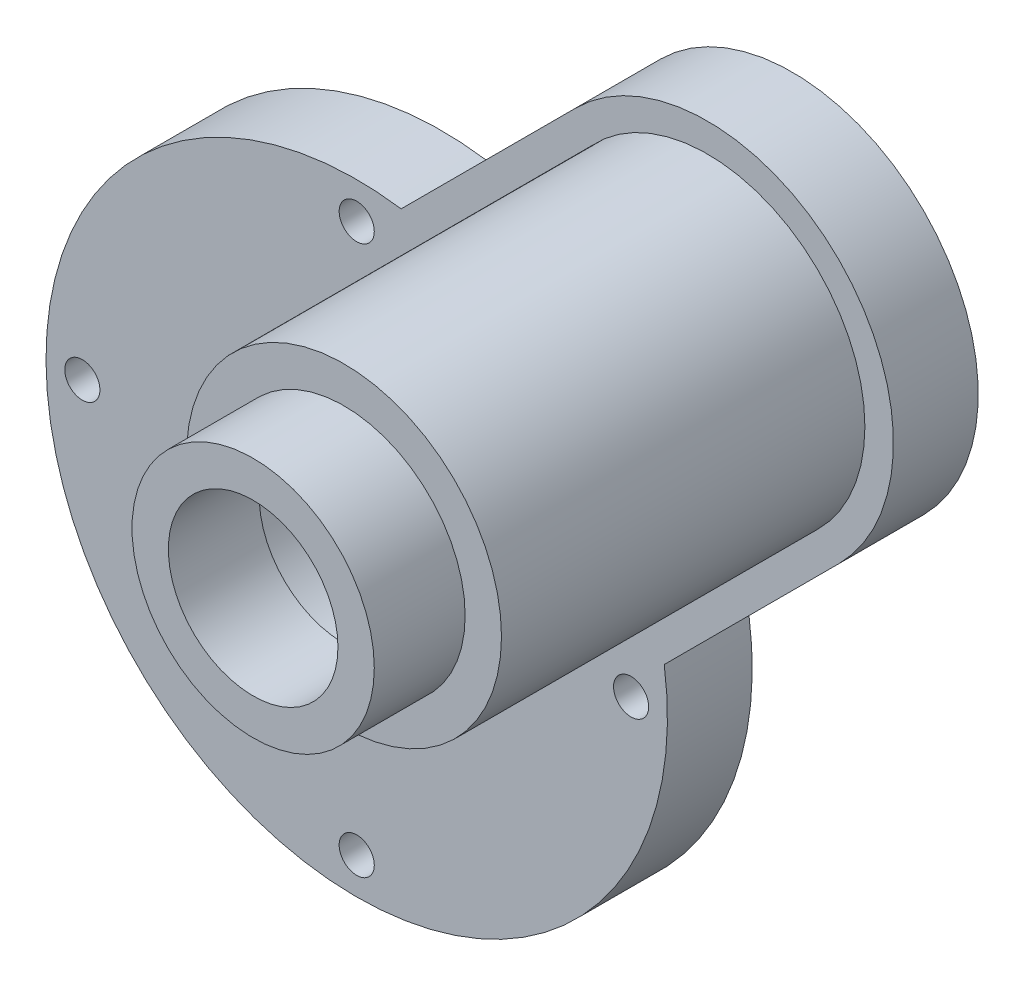
ISO-10303-21;
HEADER;
FILE_DESCRIPTION(('STEP AP214'),'2;1');
FILE_NAME('part.step','',(''),(''),'','','');
FILE_SCHEMA(('AUTOMOTIVE_DESIGN { 1 0 10303 214 1 1 1 1 }'));
ENDSEC;
DATA;
#1=APPLICATION_CONTEXT('core data for automotive mechanical design processes');
#2=APPLICATION_PROTOCOL_DEFINITION('international standard','automotive_design',2000,#1);
#3=PRODUCT_CONTEXT('',#1,'mechanical');
#4=PRODUCT('Part','Part','',(#3));
#5=PRODUCT_RELATED_PRODUCT_CATEGORY('part','',(#4));
#6=PRODUCT_DEFINITION_FORMATION('','',#4);
#7=PRODUCT_DEFINITION_CONTEXT('part definition',#1,'design');
#8=PRODUCT_DEFINITION('design','',#6,#7);
#9=PRODUCT_DEFINITION_SHAPE('','',#8);
#10=(LENGTH_UNIT() NAMED_UNIT(*) SI_UNIT(.MILLI.,.METRE.));
#11=(NAMED_UNIT(*) PLANE_ANGLE_UNIT() SI_UNIT($,.RADIAN.));
#12=(NAMED_UNIT(*) SI_UNIT($,.STERADIAN.) SOLID_ANGLE_UNIT());
#13=UNCERTAINTY_MEASURE_WITH_UNIT(LENGTH_MEASURE(1.E-05),#10,'distance_accuracy_value','');
#14=(GEOMETRIC_REPRESENTATION_CONTEXT(3) GLOBAL_UNCERTAINTY_ASSIGNED_CONTEXT((#13)) GLOBAL_UNIT_ASSIGNED_CONTEXT((#10,
#11,#12)) REPRESENTATION_CONTEXT('',''));
#15=CARTESIAN_POINT('',(0.,0.,0.));
#16=DIRECTION('',(0.,0.,1.));
#17=DIRECTION('',(1.,0.,0.));
#18=AXIS2_PLACEMENT_3D('',#15,#16,#17);
#19=CARTESIAN_POINT('',(0.,0.,7.));
#20=DIRECTION('',(0.,0.,1.));
#21=DIRECTION('',(1.,0.,0.));
#22=AXIS2_PLACEMENT_3D('',#19,#20,#21);
#23=PLANE('',#22);
#24=CARTESIAN_POINT('',(0.,0.,7.));
#25=DIRECTION('',(0.,0.,1.));
#26=DIRECTION('',(1.,0.,0.));
#27=AXIS2_PLACEMENT_3D('',#24,#25,#26);
#28=CIRCLE('',#27,25.65);
#29=CARTESIAN_POINT('',(3.66864014307868,25.3862872334769,7.));
#30=VERTEX_POINT('',#29);
#31=CARTESIAN_POINT('',(25.3862872334769,3.66864014307877,7.));
#32=VERTEX_POINT('',#31);
#33=EDGE_CURVE('E88',#30,#32,#28,.T.);
#34=ORIENTED_EDGE('',*,*,#33,.T.);
#35=DIRECTION('',(-0.707106781186545,-0.70710678118655,0.));
#36=VECTOR('',#35,1.);
#37=CARTESIAN_POINT('',(10.8588235451991,-10.8588235451991,7.));
#38=LINE('',#37,#36);
#39=CARTESIAN_POINT('',(39.8101117808026,18.0924646904046,7.));
#40=VERTEX_POINT('',#39);
#41=EDGE_CURVE('E95',#40,#32,#38,.T.);
#42=ORIENTED_EDGE('',*,*,#41,.F.);
#43=CARTESIAN_POINT('',(28.9512882356036,28.9512882356036,7.));
#44=DIRECTION('',(0.,0.,1.));
#45=DIRECTION('',(1.,0.,0.));
#46=AXIS2_PLACEMENT_3D('',#43,#44,#45);
#47=CIRCLE('',#46,15.3566955290368);
#48=CARTESIAN_POINT('',(18.0924646904044,39.8101117808027,7.));
#49=VERTEX_POINT('',#48);
#50=EDGE_CURVE('E104',#49,#40,#47,.F.);
#51=ORIENTED_EDGE('',*,*,#50,.F.);
#52=DIRECTION('',(-0.707106781186547,-0.707106781186548,0.));
#53=VECTOR('',#52,1.);
#54=CARTESIAN_POINT('',(-10.8588235451991,10.8588235451991,7.));
#55=LINE('',#54,#53);
#56=EDGE_CURVE('E65',#49,#30,#55,.T.);
#57=ORIENTED_EDGE('',*,*,#56,.T.);
#58=EDGE_LOOP('',(#34,#42,#51,#57));
#59=FACE_BOUND('',#58,.T.);
#60=CARTESIAN_POINT('',(22.65,0.,7.));
#61=DIRECTION('',(0.,0.,1.));
#62=DIRECTION('',(1.,0.,0.));
#63=AXIS2_PLACEMENT_3D('',#60,#61,#62);
#64=CIRCLE('',#63,1.45);
#65=CARTESIAN_POINT('',(24.1,0.,7.));
#66=VERTEX_POINT('',#65);
#67=EDGE_CURVE('E206',#66,#66,#64,.T.);
#68=ORIENTED_EDGE('',*,*,#67,.F.);
#69=EDGE_LOOP('',(#68));
#70=FACE_BOUND('',#69,.T.);
#71=CARTESIAN_POINT('',(0.,0.,7.));
#72=DIRECTION('',(0.,0.,1.));
#73=DIRECTION('',(1.,0.,0.));
#74=AXIS2_PLACEMENT_3D('',#71,#72,#73);
#75=CIRCLE('',#74,4.);
#76=CARTESIAN_POINT('',(4.,0.,7.));
#77=VERTEX_POINT('',#76);
#78=EDGE_CURVE('E202',#77,#77,#75,.T.);
#79=ORIENTED_EDGE('',*,*,#78,.F.);
#80=EDGE_LOOP('',(#79));
#81=FACE_BOUND('',#80,.T.);
#82=CARTESIAN_POINT('',(0.,-22.65,7.));
#83=DIRECTION('',(0.,0.,1.));
#84=DIRECTION('',(1.,0.,0.));
#85=AXIS2_PLACEMENT_3D('',#82,#83,#84);
#86=CIRCLE('',#85,1.45);
#87=CARTESIAN_POINT('',(1.44999999999992,-22.65,7.));
#88=VERTEX_POINT('',#87);
#89=EDGE_CURVE('E198',#88,#88,#86,.T.);
#90=ORIENTED_EDGE('',*,*,#89,.F.);
#91=EDGE_LOOP('',(#90));
#92=FACE_BOUND('',#91,.T.);
#93=CARTESIAN_POINT('',(-22.65,1.58164104649594E-13,7.));
#94=DIRECTION('',(0.,0.,1.));
#95=DIRECTION('',(1.,0.,0.));
#96=AXIS2_PLACEMENT_3D('',#93,#94,#95);
#97=CIRCLE('',#96,1.45);
#98=CARTESIAN_POINT('',(-21.2,1.58164104649594E-13,7.));
#99=VERTEX_POINT('',#98);
#100=EDGE_CURVE('E194',#99,#99,#97,.T.);
#101=ORIENTED_EDGE('',*,*,#100,.F.);
#102=EDGE_LOOP('',(#101));
#103=FACE_BOUND('',#102,.T.);
#104=CARTESIAN_POINT('',(2.37246156974391E-13,22.65,7.));
#105=DIRECTION('',(0.,0.,1.));
#106=DIRECTION('',(1.,0.,0.));
#107=AXIS2_PLACEMENT_3D('',#104,#105,#106);
#108=CIRCLE('',#107,1.45);
#109=CARTESIAN_POINT('',(1.45000000000024,22.65,7.));
#110=VERTEX_POINT('',#109);
#111=EDGE_CURVE('E151',#110,#110,#108,.T.);
#112=ORIENTED_EDGE('',*,*,#111,.F.);
#113=EDGE_LOOP('',(#112));
#114=FACE_BOUND('',#113,.T.);
#115=CARTESIAN_POINT('',(28.9512882356036,28.9512882356036,7.));
#116=DIRECTION('',(0.,0.,1.));
#117=DIRECTION('',(1.,0.,0.));
#118=AXIS2_PLACEMENT_3D('',#115,#116,#117);
#119=CIRCLE('',#118,13.);
#120=CARTESIAN_POINT('',(41.9512882356036,28.9512882356036,7.));
#121=VERTEX_POINT('',#120);
#122=EDGE_CURVE('E176',#121,#121,#119,.T.);
#123=ORIENTED_EDGE('',*,*,#122,.F.);
#124=EDGE_LOOP('',(#123));
#125=FACE_BOUND('',#124,.T.);
#126=ADVANCED_FACE('F47',(#59,#70,#81,#92,#103,#114,#125),#23,.T.);
#127=CARTESIAN_POINT('',(0.,0.,7.));
#128=DIRECTION('',(0.,0.,-1.));
#129=DIRECTION('',(-1.,0.,0.));
#130=AXIS2_PLACEMENT_3D('',#127,#128,#129);
#131=CYLINDRICAL_SURFACE('',#130,25.65);
#132=CARTESIAN_POINT('',(0.,0.,0.));
#133=DIRECTION('',(0.,0.,1.));
#134=DIRECTION('',(1.,0.,0.));
#135=AXIS2_PLACEMENT_3D('',#132,#133,#134);
#136=CIRCLE('',#135,25.65);
#137=CARTESIAN_POINT('',(3.66864014307868,25.3862872334769,0.));
#138=VERTEX_POINT('',#137);
#139=CARTESIAN_POINT('',(25.3862872334769,3.66864014307877,0.));
#140=VERTEX_POINT('',#139);
#141=EDGE_CURVE('E136',#138,#140,#136,.T.);
#142=ORIENTED_EDGE('',*,*,#141,.T.);
#143=DIRECTION('',(0.,0.,-1.));
#144=VECTOR('',#143,1.);
#145=CARTESIAN_POINT('',(25.3862872334769,3.66864014307877,7.));
#146=LINE('',#145,#144);
#147=EDGE_CURVE('E11',#32,#140,#146,.T.);
#148=ORIENTED_EDGE('',*,*,#147,.F.);
#149=ORIENTED_EDGE('',*,*,#33,.F.);
#150=DIRECTION('',(0.,0.,-1.));
#151=VECTOR('',#150,1.);
#152=CARTESIAN_POINT('',(3.66864014307868,25.3862872334769,7.));
#153=LINE('',#152,#151);
#154=EDGE_CURVE('E111',#30,#138,#153,.T.);
#155=ORIENTED_EDGE('',*,*,#154,.T.);
#156=EDGE_LOOP('',(#142,#148,#149,#155));
#157=FACE_BOUND('',#156,.T.);
#158=ADVANCED_FACE('F157',(#157),#131,.T.);
#159=CARTESIAN_POINT('',(10.8588235451991,-10.8588235451991,7.));
#160=DIRECTION('',(0.70710678118655,-0.707106781186545,0.));
#161=DIRECTION('',(0.707106781186545,0.70710678118655,0.));
#162=AXIS2_PLACEMENT_3D('',#159,#160,#161);
#163=PLANE('',#162);
#164=DIRECTION('',(-0.707106781186545,-0.70710678118655,0.));
#165=VECTOR('',#164,1.);
#166=CARTESIAN_POINT('',(10.8588235451991,-10.8588235451991,0.));
#167=LINE('',#166,#165);
#168=CARTESIAN_POINT('',(39.8101117808026,18.0924646904046,0.));
#169=VERTEX_POINT('',#168);
#170=EDGE_CURVE('E97',#169,#140,#167,.T.);
#171=ORIENTED_EDGE('',*,*,#170,.F.);
#172=DIRECTION('',(0.,0.,-1.));
#173=VECTOR('',#172,1.);
#174=CARTESIAN_POINT('',(39.8101117808026,18.0924646904046,7.));
#175=LINE('',#174,#173);
#176=EDGE_CURVE('E57',#40,#169,#175,.T.);
#177=ORIENTED_EDGE('',*,*,#176,.F.);
#178=ORIENTED_EDGE('',*,*,#41,.T.);
#179=ORIENTED_EDGE('',*,*,#147,.T.);
#180=EDGE_LOOP('',(#171,#177,#178,#179));
#181=FACE_BOUND('',#180,.T.);
#182=ADVANCED_FACE('F94',(#181),#163,.T.);
#183=CARTESIAN_POINT('',(28.9512882356036,28.9512882356036,7.));
#184=DIRECTION('',(0.,0.,-1.));
#185=DIRECTION('',(-1.,0.,0.));
#186=AXIS2_PLACEMENT_3D('',#183,#184,#185);
#187=CYLINDRICAL_SURFACE('',#186,15.3566955290368);
#188=CARTESIAN_POINT('',(28.9512882356036,28.9512882356036,0.));
#189=DIRECTION('',(0.,0.,1.));
#190=DIRECTION('',(1.,0.,0.));
#191=AXIS2_PLACEMENT_3D('',#188,#189,#190);
#192=CIRCLE('',#191,15.3566955290368);
#193=CARTESIAN_POINT('',(18.0924646904044,39.8101117808027,0.));
#194=VERTEX_POINT('',#193);
#195=EDGE_CURVE('E142',#194,#169,#192,.F.);
#196=ORIENTED_EDGE('',*,*,#195,.F.);
#197=DIRECTION('',(0.,0.,-1.));
#198=VECTOR('',#197,1.);
#199=CARTESIAN_POINT('',(18.0924646904044,39.8101117808027,7.));
#200=LINE('',#199,#198);
#201=EDGE_CURVE('E80',#49,#194,#200,.T.);
#202=ORIENTED_EDGE('',*,*,#201,.F.);
#203=ORIENTED_EDGE('',*,*,#50,.T.);
#204=ORIENTED_EDGE('',*,*,#176,.T.);
#205=EDGE_LOOP('',(#196,#202,#203,#204));
#206=FACE_BOUND('',#205,.T.);
#207=ADVANCED_FACE('F107',(#206),#187,.T.);
#208=CARTESIAN_POINT('',(-10.8588235451991,10.8588235451991,7.));
#209=DIRECTION('',(0.707106781186548,-0.707106781186547,0.));
#210=DIRECTION('',(0.707106781186547,0.707106781186548,0.));
#211=AXIS2_PLACEMENT_3D('',#208,#209,#210);
#212=PLANE('',#211);
#213=DIRECTION('',(-0.707106781186547,-0.707106781186548,0.));
#214=VECTOR('',#213,1.);
#215=CARTESIAN_POINT('',(-10.8588235451991,10.8588235451991,0.));
#216=LINE('',#215,#214);
#217=EDGE_CURVE('E83',#194,#138,#216,.T.);
#218=ORIENTED_EDGE('',*,*,#217,.T.);
#219=ORIENTED_EDGE('',*,*,#154,.F.);
#220=ORIENTED_EDGE('',*,*,#56,.F.);
#221=ORIENTED_EDGE('',*,*,#201,.T.);
#222=EDGE_LOOP('',(#218,#219,#220,#221));
#223=FACE_BOUND('',#222,.T.);
#224=ADVANCED_FACE('F244',(#223),#212,.F.);
#225=CARTESIAN_POINT('',(22.65,0.,7.));
#226=DIRECTION('',(0.,0.,-1.));
#227=DIRECTION('',(-1.,0.,0.));
#228=AXIS2_PLACEMENT_3D('',#225,#226,#227);
#229=CYLINDRICAL_SURFACE('',#228,1.45);
#230=ORIENTED_EDGE('',*,*,#67,.T.);
#231=EDGE_LOOP('',(#230));
#232=FACE_BOUND('',#231,.T.);
#233=CARTESIAN_POINT('',(22.65,0.,0.));
#234=DIRECTION('',(0.,0.,1.));
#235=DIRECTION('',(1.,0.,0.));
#236=AXIS2_PLACEMENT_3D('',#233,#234,#235);
#237=CIRCLE('',#236,1.45);
#238=CARTESIAN_POINT('',(24.1,0.,0.));
#239=VERTEX_POINT('',#238);
#240=EDGE_CURVE('E132',#239,#239,#237,.T.);
#241=ORIENTED_EDGE('',*,*,#240,.F.);
#242=EDGE_LOOP('',(#241));
#243=FACE_BOUND('',#242,.T.);
#244=ADVANCED_FACE('F212',(#232,#243),#229,.F.);
#245=CARTESIAN_POINT('',(0.,0.,7.));
#246=DIRECTION('',(0.,0.,-1.));
#247=DIRECTION('',(-1.,0.,0.));
#248=AXIS2_PLACEMENT_3D('',#245,#246,#247);
#249=CYLINDRICAL_SURFACE('',#248,4.);
#250=ORIENTED_EDGE('',*,*,#78,.T.);
#251=EDGE_LOOP('',(#250));
#252=FACE_BOUND('',#251,.T.);
#253=CARTESIAN_POINT('',(0.,0.,0.));
#254=DIRECTION('',(0.,0.,1.));
#255=DIRECTION('',(1.,0.,0.));
#256=AXIS2_PLACEMENT_3D('',#253,#254,#255);
#257=CIRCLE('',#256,4.);
#258=CARTESIAN_POINT('',(4.,0.,0.));
#259=VERTEX_POINT('',#258);
#260=EDGE_CURVE('E128',#259,#259,#257,.T.);
#261=ORIENTED_EDGE('',*,*,#260,.F.);
#262=EDGE_LOOP('',(#261));
#263=FACE_BOUND('',#262,.T.);
#264=ADVANCED_FACE('F255',(#252,#263),#249,.F.);
#265=CARTESIAN_POINT('',(0.,-22.65,7.));
#266=DIRECTION('',(0.,0.,-1.));
#267=DIRECTION('',(-1.,0.,0.));
#268=AXIS2_PLACEMENT_3D('',#265,#266,#267);
#269=CYLINDRICAL_SURFACE('',#268,1.45);
#270=ORIENTED_EDGE('',*,*,#89,.T.);
#271=EDGE_LOOP('',(#270));
#272=FACE_BOUND('',#271,.T.);
#273=CARTESIAN_POINT('',(0.,-22.65,0.));
#274=DIRECTION('',(0.,0.,1.));
#275=DIRECTION('',(1.,0.,0.));
#276=AXIS2_PLACEMENT_3D('',#273,#274,#275);
#277=CIRCLE('',#276,1.45);
#278=CARTESIAN_POINT('',(1.44999999999992,-22.65,0.));
#279=VERTEX_POINT('',#278);
#280=EDGE_CURVE('E124',#279,#279,#277,.T.);
#281=ORIENTED_EDGE('',*,*,#280,.F.);
#282=EDGE_LOOP('',(#281));
#283=FACE_BOUND('',#282,.T.);
#284=ADVANCED_FACE('F258',(#272,#283),#269,.F.);
#285=CARTESIAN_POINT('',(-22.65,1.58164104649594E-13,7.));
#286=DIRECTION('',(0.,0.,-1.));
#287=DIRECTION('',(-1.,0.,0.));
#288=AXIS2_PLACEMENT_3D('',#285,#286,#287);
#289=CYLINDRICAL_SURFACE('',#288,1.45);
#290=ORIENTED_EDGE('',*,*,#100,.T.);
#291=EDGE_LOOP('',(#290));
#292=FACE_BOUND('',#291,.T.);
#293=CARTESIAN_POINT('',(-22.65,1.58164104649594E-13,0.));
#294=DIRECTION('',(0.,0.,1.));
#295=DIRECTION('',(1.,0.,0.));
#296=AXIS2_PLACEMENT_3D('',#293,#294,#295);
#297=CIRCLE('',#296,1.45);
#298=CARTESIAN_POINT('',(-21.2,1.58164104649594E-13,0.));
#299=VERTEX_POINT('',#298);
#300=EDGE_CURVE('E119',#299,#299,#297,.T.);
#301=ORIENTED_EDGE('',*,*,#300,.F.);
#302=EDGE_LOOP('',(#301));
#303=FACE_BOUND('',#302,.T.);
#304=ADVANCED_FACE('F261',(#292,#303),#289,.F.);
#305=CARTESIAN_POINT('',(2.37246156974391E-13,22.65,7.));
#306=DIRECTION('',(0.,0.,-1.));
#307=DIRECTION('',(-1.,0.,0.));
#308=AXIS2_PLACEMENT_3D('',#305,#306,#307);
#309=CYLINDRICAL_SURFACE('',#308,1.45);
#310=ORIENTED_EDGE('',*,*,#111,.T.);
#311=EDGE_LOOP('',(#310));
#312=FACE_BOUND('',#311,.T.);
#313=CARTESIAN_POINT('',(2.37246156974391E-13,22.65,0.));
#314=DIRECTION('',(0.,0.,1.));
#315=DIRECTION('',(1.,0.,0.));
#316=AXIS2_PLACEMENT_3D('',#313,#314,#315);
#317=CIRCLE('',#316,1.45);
#318=CARTESIAN_POINT('',(1.45000000000024,22.65,0.));
#319=VERTEX_POINT('',#318);
#320=EDGE_CURVE('E115',#319,#319,#317,.T.);
#321=ORIENTED_EDGE('',*,*,#320,.F.);
#322=EDGE_LOOP('',(#321));
#323=FACE_BOUND('',#322,.T.);
#324=ADVANCED_FACE('F49',(#312,#323),#309,.F.);
#325=CARTESIAN_POINT('',(28.9512882356036,28.9512882356036,7.));
#326=DIRECTION('',(0.,0.,-1.));
#327=DIRECTION('',(-1.,0.,0.));
#328=AXIS2_PLACEMENT_3D('',#325,#326,#327);
#329=CYLINDRICAL_SURFACE('',#328,9.);
#330=CARTESIAN_POINT('',(28.9512882356036,28.9512882356036,0.));
#331=DIRECTION('',(0.,0.,1.));
#332=DIRECTION('',(1.,0.,0.));
#333=AXIS2_PLACEMENT_3D('',#330,#331,#332);
#334=CIRCLE('',#333,9.);
#335=CARTESIAN_POINT('',(37.9512882356036,28.9512882356036,0.));
#336=VERTEX_POINT('',#335);
#337=EDGE_CURVE('E147',#336,#336,#334,.T.);
#338=ORIENTED_EDGE('',*,*,#337,.F.);
#339=EDGE_LOOP('',(#338));
#340=FACE_BOUND('',#339,.T.);
#341=CARTESIAN_POINT('',(28.9512882356036,28.9512882356036,37.));
#342=DIRECTION('',(0.,0.,1.));
#343=DIRECTION('',(1.,0.,0.));
#344=AXIS2_PLACEMENT_3D('',#341,#342,#343);
#345=CIRCLE('',#344,9.);
#346=CARTESIAN_POINT('',(37.9512882356036,28.9512882356036,37.));
#347=VERTEX_POINT('',#346);
#348=EDGE_CURVE('E173',#347,#347,#345,.T.);
#349=ORIENTED_EDGE('',*,*,#348,.T.);
#350=EDGE_LOOP('',(#349));
#351=FACE_BOUND('',#350,.T.);
#352=ADVANCED_FACE('F163',(#340,#351),#329,.F.);
#353=CARTESIAN_POINT('',(0.,0.,0.));
#354=DIRECTION('',(0.,0.,1.));
#355=DIRECTION('',(1.,0.,0.));
#356=AXIS2_PLACEMENT_3D('',#353,#354,#355);
#357=PLANE('',#356);
#358=ORIENTED_EDGE('',*,*,#320,.T.);
#359=EDGE_LOOP('',(#358));
#360=FACE_BOUND('',#359,.T.);
#361=ORIENTED_EDGE('',*,*,#300,.T.);
#362=EDGE_LOOP('',(#361));
#363=FACE_BOUND('',#362,.T.);
#364=ORIENTED_EDGE('',*,*,#280,.T.);
#365=EDGE_LOOP('',(#364));
#366=FACE_BOUND('',#365,.T.);
#367=ORIENTED_EDGE('',*,*,#260,.T.);
#368=EDGE_LOOP('',(#367));
#369=FACE_BOUND('',#368,.T.);
#370=ORIENTED_EDGE('',*,*,#240,.T.);
#371=EDGE_LOOP('',(#370));
#372=FACE_BOUND('',#371,.T.);
#373=ORIENTED_EDGE('',*,*,#141,.F.);
#374=ORIENTED_EDGE('',*,*,#217,.F.);
#375=ORIENTED_EDGE('',*,*,#195,.T.);
#376=ORIENTED_EDGE('',*,*,#170,.T.);
#377=EDGE_LOOP('',(#373,#374,#375,#376));
#378=FACE_BOUND('',#377,.T.);
#379=ORIENTED_EDGE('',*,*,#337,.T.);
#380=EDGE_LOOP('',(#379));
#381=FACE_BOUND('',#380,.T.);
#382=ADVANCED_FACE('F159',(#360,#363,#366,#369,#372,#378,#381),#357,.F.);
#383=CARTESIAN_POINT('',(28.9512882356036,28.9512882356036,37.));
#384=DIRECTION('',(0.,0.,1.));
#385=DIRECTION('',(1.,0.,0.));
#386=AXIS2_PLACEMENT_3D('',#383,#384,#385);
#387=PLANE('',#386);
#388=CARTESIAN_POINT('',(28.9512882356036,28.9512882356036,37.));
#389=DIRECTION('',(0.,0.,1.));
#390=DIRECTION('',(1.,0.,0.));
#391=AXIS2_PLACEMENT_3D('',#388,#389,#390);
#392=CIRCLE('',#391,10.);
#393=CARTESIAN_POINT('',(38.9512882356036,28.9512882356036,37.));
#394=VERTEX_POINT('',#393);
#395=EDGE_CURVE('E184',#394,#394,#392,.T.);
#396=ORIENTED_EDGE('',*,*,#395,.F.);
#397=EDGE_LOOP('',(#396));
#398=FACE_BOUND('',#397,.T.);
#399=CARTESIAN_POINT('',(28.9512882356036,28.9512882356036,37.));
#400=DIRECTION('',(0.,0.,1.));
#401=DIRECTION('',(1.,0.,0.));
#402=AXIS2_PLACEMENT_3D('',#399,#400,#401);
#403=CIRCLE('',#402,13.);
#404=CARTESIAN_POINT('',(41.9512882356036,28.9512882356036,37.));
#405=VERTEX_POINT('',#404);
#406=EDGE_CURVE('E120',#405,#405,#403,.T.);
#407=ORIENTED_EDGE('',*,*,#406,.T.);
#408=EDGE_LOOP('',(#407));
#409=FACE_BOUND('',#408,.T.);
#410=ADVANCED_FACE('F162',(#398,#409),#387,.T.);
#411=CARTESIAN_POINT('',(28.9512882356036,28.9512882356036,37.));
#412=DIRECTION('',(0.,0.,-1.));
#413=DIRECTION('',(-1.,0.,0.));
#414=AXIS2_PLACEMENT_3D('',#411,#412,#413);
#415=CYLINDRICAL_SURFACE('',#414,13.);
#416=ORIENTED_EDGE('',*,*,#406,.F.);
#417=EDGE_LOOP('',(#416));
#418=FACE_BOUND('',#417,.T.);
#419=ORIENTED_EDGE('',*,*,#122,.T.);
#420=EDGE_LOOP('',(#419));
#421=FACE_BOUND('',#420,.T.);
#422=ADVANCED_FACE('F227',(#418,#421),#415,.T.);
#423=CARTESIAN_POINT('',(28.9512882356036,28.9512882356036,37.));
#424=DIRECTION('',(0.,0.,1.));
#425=DIRECTION('',(1.,0.,0.));
#426=AXIS2_PLACEMENT_3D('',#423,#424,#425);
#427=PLANE('',#426);
#428=CARTESIAN_POINT('',(28.9512882356036,28.9512882356036,37.));
#429=DIRECTION('',(0.,0.,1.));
#430=DIRECTION('',(1.,0.,0.));
#431=AXIS2_PLACEMENT_3D('',#428,#429,#430);
#432=CIRCLE('',#431,7.);
#433=CARTESIAN_POINT('',(35.9512882356036,28.9512882356036,37.));
#434=VERTEX_POINT('',#433);
#435=EDGE_CURVE('E358',#434,#434,#432,.T.);
#436=ORIENTED_EDGE('',*,*,#435,.T.);
#437=EDGE_LOOP('',(#436));
#438=FACE_BOUND('',#437,.T.);
#439=ORIENTED_EDGE('',*,*,#348,.F.);
#440=EDGE_LOOP('',(#439));
#441=FACE_BOUND('',#440,.T.);
#442=ADVANCED_FACE('F229',(#438,#441),#427,.F.);
#443=CARTESIAN_POINT('',(28.9512882356036,28.9512882356036,44.5));
#444=DIRECTION('',(0.,0.,1.));
#445=DIRECTION('',(1.,0.,0.));
#446=AXIS2_PLACEMENT_3D('',#443,#444,#445);
#447=PLANE('',#446);
#448=CARTESIAN_POINT('',(28.9512882356036,28.9512882356036,44.5));
#449=DIRECTION('',(0.,0.,1.));
#450=DIRECTION('',(1.,0.,0.));
#451=AXIS2_PLACEMENT_3D('',#448,#449,#450);
#452=CIRCLE('',#451,10.);
#453=CARTESIAN_POINT('',(38.9512882356036,28.9512882356036,44.5));
#454=VERTEX_POINT('',#453);
#455=EDGE_CURVE('E177',#454,#454,#452,.T.);
#456=ORIENTED_EDGE('',*,*,#455,.T.);
#457=EDGE_LOOP('',(#456));
#458=FACE_BOUND('',#457,.T.);
#459=CARTESIAN_POINT('',(28.9512882356036,28.9512882356036,44.5));
#460=DIRECTION('',(0.,0.,1.));
#461=DIRECTION('',(1.,0.,0.));
#462=AXIS2_PLACEMENT_3D('',#459,#460,#461);
#463=CIRCLE('',#462,7.);
#464=CARTESIAN_POINT('',(35.9512882356036,28.9512882356036,44.5));
#465=VERTEX_POINT('',#464);
#466=EDGE_CURVE('E355',#465,#465,#463,.T.);
#467=ORIENTED_EDGE('',*,*,#466,.F.);
#468=EDGE_LOOP('',(#467));
#469=FACE_BOUND('',#468,.T.);
#470=ADVANCED_FACE('F236',(#458,#469),#447,.T.);
#471=CARTESIAN_POINT('',(28.9512882356036,28.9512882356036,44.5));
#472=DIRECTION('',(0.,0.,-1.));
#473=DIRECTION('',(-1.,0.,0.));
#474=AXIS2_PLACEMENT_3D('',#471,#472,#473);
#475=CYLINDRICAL_SURFACE('',#474,10.);
#476=ORIENTED_EDGE('',*,*,#455,.F.);
#477=EDGE_LOOP('',(#476));
#478=FACE_BOUND('',#477,.T.);
#479=ORIENTED_EDGE('',*,*,#395,.T.);
#480=EDGE_LOOP('',(#479));
#481=FACE_BOUND('',#480,.T.);
#482=ADVANCED_FACE('F330',(#478,#481),#475,.T.);
#483=CARTESIAN_POINT('',(28.9512882356036,28.9512882356036,44.5));
#484=DIRECTION('',(0.,0.,-1.));
#485=DIRECTION('',(-1.,0.,0.));
#486=AXIS2_PLACEMENT_3D('',#483,#484,#485);
#487=CYLINDRICAL_SURFACE('',#486,7.);
#488=ORIENTED_EDGE('',*,*,#466,.T.);
#489=EDGE_LOOP('',(#488));
#490=FACE_BOUND('',#489,.T.);
#491=ORIENTED_EDGE('',*,*,#435,.F.);
#492=EDGE_LOOP('',(#491));
#493=FACE_BOUND('',#492,.T.);
#494=ADVANCED_FACE('F340',(#490,#493),#487,.F.);
#495=CLOSED_SHELL('',(#126,#158,#182,#207,#224,#244,#264,#284,#304,#324,#352,#382,#410,#422,
#442,#470,#482,#494));
#496=MANIFOLD_SOLID_BREP('B2',#495);
#497=ADVANCED_BREP_SHAPE_REPRESENTATION('',(#18,#496),#14);
#498=SHAPE_DEFINITION_REPRESENTATION(#9,#497);
ENDSEC;
END-ISO-10303-21;
